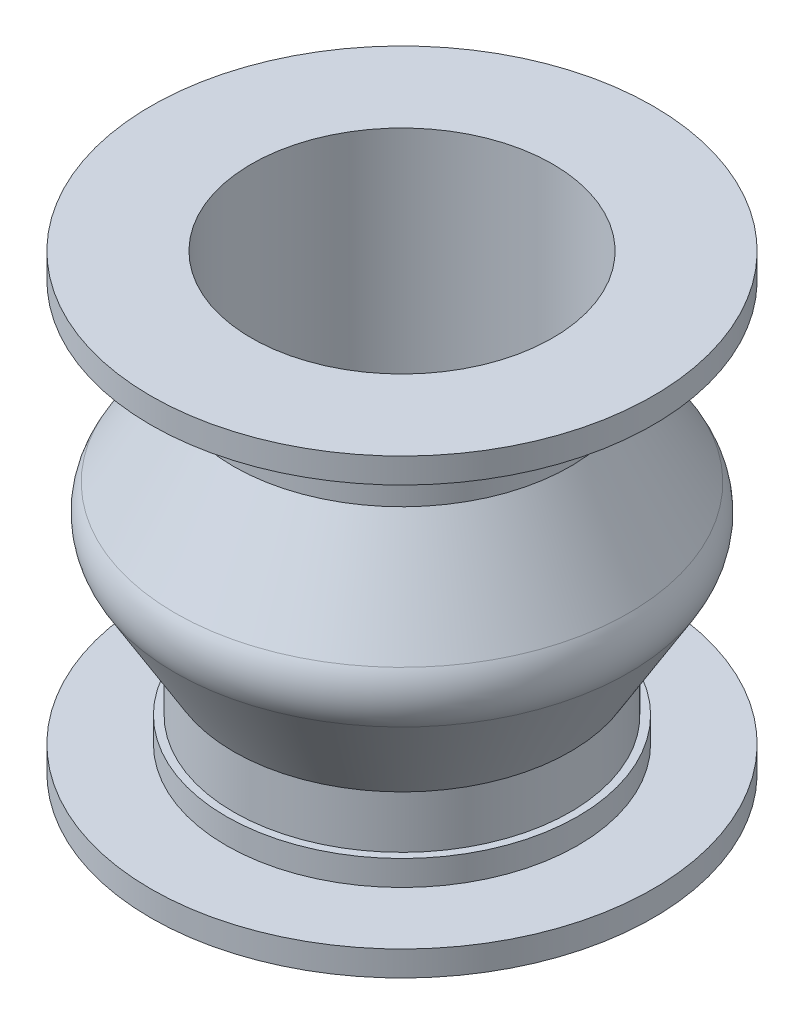
ISO-10303-21;
HEADER;
FILE_DESCRIPTION(('STEP AP214'),'2;1');
FILE_NAME('part.step','',(''),(''),'','','');
FILE_SCHEMA(('AUTOMOTIVE_DESIGN { 1 0 10303 214 1 1 1 1 }'));
ENDSEC;
DATA;
#1=APPLICATION_CONTEXT('core data for automotive mechanical design processes');
#2=APPLICATION_PROTOCOL_DEFINITION('international standard','automotive_design',2000,#1);
#3=PRODUCT_CONTEXT('',#1,'mechanical');
#4=PRODUCT('Part','Part','',(#3));
#5=PRODUCT_RELATED_PRODUCT_CATEGORY('part','',(#4));
#6=PRODUCT_DEFINITION_FORMATION('','',#4);
#7=PRODUCT_DEFINITION_CONTEXT('part definition',#1,'design');
#8=PRODUCT_DEFINITION('design','',#6,#7);
#9=PRODUCT_DEFINITION_SHAPE('','',#8);
#10=(LENGTH_UNIT() NAMED_UNIT(*) SI_UNIT(.MILLI.,.METRE.));
#11=(NAMED_UNIT(*) PLANE_ANGLE_UNIT() SI_UNIT($,.RADIAN.));
#12=(NAMED_UNIT(*) SI_UNIT($,.STERADIAN.) SOLID_ANGLE_UNIT());
#13=UNCERTAINTY_MEASURE_WITH_UNIT(LENGTH_MEASURE(1.E-05),#10,'distance_accuracy_value','');
#14=(GEOMETRIC_REPRESENTATION_CONTEXT(3) GLOBAL_UNCERTAINTY_ASSIGNED_CONTEXT((#13)) GLOBAL_UNIT_ASSIGNED_CONTEXT((#10,
#11,#12)) REPRESENTATION_CONTEXT('',''));
#15=CARTESIAN_POINT('',(0.,0.,0.));
#16=DIRECTION('',(0.,0.,1.));
#17=DIRECTION('',(1.,0.,0.));
#18=AXIS2_PLACEMENT_3D('',#15,#16,#17);
#19=CARTESIAN_POINT('',(0.,78.932584269663,0.));
#20=DIRECTION('',(0.,1.,0.));
#21=DIRECTION('',(0.,0.,1.));
#22=AXIS2_PLACEMENT_3D('',#19,#20,#21);
#23=CYLINDRICAL_SURFACE('',#22,35.);
#24=CARTESIAN_POINT('',(0.,40.,0.));
#25=DIRECTION('',(0.,1.,0.));
#26=DIRECTION('',(0.,0.,1.));
#27=AXIS2_PLACEMENT_3D('',#24,#25,#26);
#28=CIRCLE('',#27,35.);
#29=CARTESIAN_POINT('',(-5.,40.,-34.6410161513776));
#30=VERTEX_POINT('',#29);
#31=CARTESIAN_POINT('',(4.99999999999999,40.,-34.6410161513776));
#32=VERTEX_POINT('',#31);
#33=EDGE_CURVE('E133',#30,#32,#28,.T.);
#34=ORIENTED_EDGE('',*,*,#33,.F.);
#35=DIRECTION('',(0.,-1.,0.));
#36=VECTOR('',#35,1.);
#37=CARTESIAN_POINT('',(-5.,40.,-34.6410161513776));
#38=LINE('',#37,#36);
#39=CARTESIAN_POINT('',(-5.,35.,-34.6410161513776));
#40=VERTEX_POINT('',#39);
#41=EDGE_CURVE('E89',#30,#40,#38,.T.);
#42=ORIENTED_EDGE('',*,*,#41,.T.);
#43=CARTESIAN_POINT('',(0.,35.,0.));
#44=DIRECTION('',(0.,1.,0.));
#45=DIRECTION('',(0.,0.,1.));
#46=AXIS2_PLACEMENT_3D('',#43,#44,#45);
#47=CIRCLE('',#46,35.);
#48=CARTESIAN_POINT('',(4.99999999999999,35.,-34.6410161513776));
#49=VERTEX_POINT('',#48);
#50=EDGE_CURVE('E136',#40,#49,#47,.T.);
#51=ORIENTED_EDGE('',*,*,#50,.T.);
#52=DIRECTION('',(0.,-1.,0.));
#53=VECTOR('',#52,1.);
#54=CARTESIAN_POINT('',(4.99999999999999,40.,-34.6410161513776));
#55=LINE('',#54,#53);
#56=EDGE_CURVE('E121',#32,#49,#55,.T.);
#57=ORIENTED_EDGE('',*,*,#56,.F.);
#58=EDGE_LOOP('',(#34,#42,#51,#57));
#59=FACE_BOUND('',#58,.T.);
#60=ADVANCED_FACE('F38',(#59),#23,.T.);
#61=CARTESIAN_POINT('',(-50.,40.,0.));
#62=DIRECTION('',(0.,-1.,0.));
#63=DIRECTION('',(0.,0.,-1.));
#64=AXIS2_PLACEMENT_3D('',#61,#62,#63);
#65=PLANE('',#64);
#66=CARTESIAN_POINT('',(0.,40.,0.));
#67=DIRECTION('',(0.,1.,0.));
#68=DIRECTION('',(0.,0.,1.));
#69=AXIS2_PLACEMENT_3D('',#66,#67,#68);
#70=CIRCLE('',#69,50.);
#71=CARTESIAN_POINT('',(0.,40.,50.));
#72=VERTEX_POINT('',#71);
#73=EDGE_CURVE('E129',#72,#72,#70,.T.);
#74=ORIENTED_EDGE('',*,*,#73,.F.);
#75=EDGE_LOOP('',(#74));
#76=FACE_BOUND('',#75,.T.);
#77=CARTESIAN_POINT('',(0.,40.,0.));
#78=DIRECTION('',(0.,1.,0.));
#79=DIRECTION('',(0.,0.,1.));
#80=AXIS2_PLACEMENT_3D('',#77,#78,#79);
#81=CIRCLE('',#80,37.);
#82=CARTESIAN_POINT('',(5.,40.,-36.6606055596467));
#83=VERTEX_POINT('',#82);
#84=CARTESIAN_POINT('',(-5.,40.,-36.6606055596467));
#85=VERTEX_POINT('',#84);
#86=EDGE_CURVE('E54',#83,#85,#81,.T.);
#87=ORIENTED_EDGE('',*,*,#86,.T.);
#88=DIRECTION('',(0.,0.,1.));
#89=VECTOR('',#88,1.);
#90=CARTESIAN_POINT('',(-5.,40.,-36.6606055596467));
#91=LINE('',#90,#89);
#92=EDGE_CURVE('E84',#85,#30,#91,.T.);
#93=ORIENTED_EDGE('',*,*,#92,.T.);
#94=ORIENTED_EDGE('',*,*,#33,.T.);
#95=DIRECTION('',(0.,0.,-1.));
#96=VECTOR('',#95,1.);
#97=CARTESIAN_POINT('',(5.,40.,-36.6606055596467));
#98=LINE('',#97,#96);
#99=EDGE_CURVE('E62',#32,#83,#98,.T.);
#100=ORIENTED_EDGE('',*,*,#99,.T.);
#101=EDGE_LOOP('',(#87,#93,#94,#100));
#102=FACE_BOUND('',#101,.T.);
#103=ADVANCED_FACE('F101',(#76,#102),#65,.T.);
#104=CARTESIAN_POINT('',(0.,-45.,0.));
#105=DIRECTION('',(0.,-1.,0.));
#106=DIRECTION('',(0.,0.,-1.));
#107=AXIS2_PLACEMENT_3D('',#104,#105,#106);
#108=PLANE('',#107);
#109=CARTESIAN_POINT('',(0.,-45.,0.));
#110=DIRECTION('',(0.,-1.,0.));
#111=DIRECTION('',(0.,0.,-1.));
#112=AXIS2_PLACEMENT_3D('',#109,#110,#111);
#113=CIRCLE('',#112,30.);
#114=CARTESIAN_POINT('',(0.,-45.,-30.));
#115=VERTEX_POINT('',#114);
#116=EDGE_CURVE('E108',#115,#115,#113,.T.);
#117=ORIENTED_EDGE('',*,*,#116,.F.);
#118=EDGE_LOOP('',(#117));
#119=FACE_BOUND('',#118,.T.);
#120=CARTESIAN_POINT('',(0.,-45.,0.));
#121=DIRECTION('',(0.,1.,0.));
#122=DIRECTION('',(0.,0.,1.));
#123=AXIS2_PLACEMENT_3D('',#120,#121,#122);
#124=CIRCLE('',#123,50.);
#125=CARTESIAN_POINT('',(0.,-45.,50.));
#126=VERTEX_POINT('',#125);
#127=EDGE_CURVE('E11',#126,#126,#124,.T.);
#128=ORIENTED_EDGE('',*,*,#127,.F.);
#129=EDGE_LOOP('',(#128));
#130=FACE_BOUND('',#129,.T.);
#131=ADVANCED_FACE('F40',(#119,#130),#108,.T.);
#132=CARTESIAN_POINT('',(0.,78.932584269663,0.));
#133=DIRECTION('',(0.,1.,0.));
#134=DIRECTION('',(0.,0.,1.));
#135=AXIS2_PLACEMENT_3D('',#132,#133,#134);
#136=CYLINDRICAL_SURFACE('',#135,50.);
#137=ORIENTED_EDGE('',*,*,#127,.T.);
#138=EDGE_LOOP('',(#137));
#139=FACE_BOUND('',#138,.T.);
#140=CARTESIAN_POINT('',(0.,-40.,0.));
#141=DIRECTION('',(0.,1.,0.));
#142=DIRECTION('',(0.,0.,1.));
#143=AXIS2_PLACEMENT_3D('',#140,#141,#142);
#144=CIRCLE('',#143,50.);
#145=CARTESIAN_POINT('',(0.,-40.,50.));
#146=VERTEX_POINT('',#145);
#147=EDGE_CURVE('E47',#146,#146,#144,.T.);
#148=ORIENTED_EDGE('',*,*,#147,.F.);
#149=EDGE_LOOP('',(#148));
#150=FACE_BOUND('',#149,.T.);
#151=ADVANCED_FACE('F178',(#139,#150),#136,.T.);
#152=CARTESIAN_POINT('',(-50.,-40.,0.));
#153=DIRECTION('',(0.,1.,0.));
#154=DIRECTION('',(0.,0.,1.));
#155=AXIS2_PLACEMENT_3D('',#152,#153,#154);
#156=PLANE('',#155);
#157=ORIENTED_EDGE('',*,*,#147,.T.);
#158=EDGE_LOOP('',(#157));
#159=FACE_BOUND('',#158,.T.);
#160=CARTESIAN_POINT('',(0.,-40.,0.));
#161=DIRECTION('',(0.,1.,0.));
#162=DIRECTION('',(0.,0.,1.));
#163=AXIS2_PLACEMENT_3D('',#160,#161,#162);
#164=CIRCLE('',#163,35.);
#165=CARTESIAN_POINT('',(0.,-40.,35.));
#166=VERTEX_POINT('',#165);
#167=EDGE_CURVE('E168',#166,#166,#164,.T.);
#168=ORIENTED_EDGE('',*,*,#167,.F.);
#169=EDGE_LOOP('',(#168));
#170=FACE_BOUND('',#169,.T.);
#171=ADVANCED_FACE('F175',(#159,#170),#156,.T.);
#172=CARTESIAN_POINT('',(0.,78.932584269663,0.));
#173=DIRECTION('',(0.,1.,0.));
#174=DIRECTION('',(0.,0.,1.));
#175=AXIS2_PLACEMENT_3D('',#172,#173,#174);
#176=CYLINDRICAL_SURFACE('',#175,35.);
#177=ORIENTED_EDGE('',*,*,#167,.T.);
#178=EDGE_LOOP('',(#177));
#179=FACE_BOUND('',#178,.T.);
#180=CARTESIAN_POINT('',(0.,-35.,0.));
#181=DIRECTION('',(0.,1.,0.));
#182=DIRECTION('',(0.,0.,1.));
#183=AXIS2_PLACEMENT_3D('',#180,#181,#182);
#184=CIRCLE('',#183,35.);
#185=CARTESIAN_POINT('',(0.,-35.,35.));
#186=VERTEX_POINT('',#185);
#187=EDGE_CURVE('E164',#186,#186,#184,.T.);
#188=ORIENTED_EDGE('',*,*,#187,.F.);
#189=EDGE_LOOP('',(#188));
#190=FACE_BOUND('',#189,.T.);
#191=ADVANCED_FACE('F185',(#179,#190),#176,.T.);
#192=CARTESIAN_POINT('',(-35.,-35.,0.));
#193=DIRECTION('',(0.,1.,0.));
#194=DIRECTION('',(0.,0.,1.));
#195=AXIS2_PLACEMENT_3D('',#192,#193,#194);
#196=PLANE('',#195);
#197=ORIENTED_EDGE('',*,*,#187,.T.);
#198=EDGE_LOOP('',(#197));
#199=FACE_BOUND('',#198,.T.);
#200=CARTESIAN_POINT('',(0.,-35.,0.));
#201=DIRECTION('',(0.,1.,0.));
#202=DIRECTION('',(0.,0.,1.));
#203=AXIS2_PLACEMENT_3D('',#200,#201,#202);
#204=CIRCLE('',#203,33.5);
#205=CARTESIAN_POINT('',(0.,-35.,33.5));
#206=VERTEX_POINT('',#205);
#207=EDGE_CURVE('E160',#206,#206,#204,.T.);
#208=ORIENTED_EDGE('',*,*,#207,.F.);
#209=EDGE_LOOP('',(#208));
#210=FACE_BOUND('',#209,.T.);
#211=ADVANCED_FACE('F224',(#199,#210),#196,.T.);
#212=CARTESIAN_POINT('',(0.,78.932584269663,0.));
#213=DIRECTION('',(0.,1.,0.));
#214=DIRECTION('',(0.,0.,1.));
#215=AXIS2_PLACEMENT_3D('',#212,#213,#214);
#216=CYLINDRICAL_SURFACE('',#215,33.5);
#217=ORIENTED_EDGE('',*,*,#207,.T.);
#218=EDGE_LOOP('',(#217));
#219=FACE_BOUND('',#218,.T.);
#220=CARTESIAN_POINT('',(0.,-24.5845240525774,0.));
#221=DIRECTION('',(0.,1.,0.));
#222=DIRECTION('',(0.,0.,1.));
#223=AXIS2_PLACEMENT_3D('',#220,#221,#222);
#224=CIRCLE('',#223,33.5);
#225=CARTESIAN_POINT('',(0.,-24.5845240525774,33.5));
#226=VERTEX_POINT('',#225);
#227=EDGE_CURVE('E156',#226,#226,#224,.T.);
#228=ORIENTED_EDGE('',*,*,#227,.F.);
#229=EDGE_LOOP('',(#228));
#230=FACE_BOUND('',#229,.T.);
#231=ADVANCED_FACE('F220',(#219,#230),#216,.T.);
#232=CARTESIAN_POINT('',(0.,-5.14495755427531,0.));
#233=DIRECTION('',(0.,1.,0.));
#234=DIRECTION('',(0.,0.,1.));
#235=AXIS2_PLACEMENT_3D('',#232,#233,#234);
#236=CONICAL_SURFACE('',#235,45.1637398989812,0.540419500270584);
#237=ORIENTED_EDGE('',*,*,#227,.T.);
#238=EDGE_LOOP('',(#237));
#239=FACE_BOUND('',#238,.T.);
#240=CARTESIAN_POINT('',(0.,-5.14495755427531,0.));
#241=DIRECTION('',(0.,1.,0.));
#242=DIRECTION('',(0.,0.,1.));
#243=AXIS2_PLACEMENT_3D('',#240,#241,#242);
#244=CIRCLE('',#243,45.1637398989812);
#245=CARTESIAN_POINT('',(0.,-5.14495755427531,45.1637398989812));
#246=VERTEX_POINT('',#245);
#247=EDGE_CURVE('E152',#246,#246,#244,.T.);
#248=ORIENTED_EDGE('',*,*,#247,.F.);
#249=EDGE_LOOP('',(#248));
#250=FACE_BOUND('',#249,.T.);
#251=ADVANCED_FACE('F216',(#239,#250),#236,.T.);
#252=CARTESIAN_POINT('',(0.,0.,0.));
#253=DIRECTION('',(0.,1.,0.));
#254=DIRECTION('',(0.,0.,1.));
#255=AXIS2_PLACEMENT_3D('',#252,#253,#254);
#256=TOROIDAL_SURFACE('',#255,36.5888106418558,10.);
#257=ORIENTED_EDGE('',*,*,#247,.T.);
#258=EDGE_LOOP('',(#257));
#259=FACE_BOUND('',#258,.T.);
#260=CARTESIAN_POINT('',(0.,5.14495755427531,0.));
#261=DIRECTION('',(0.,1.,0.));
#262=DIRECTION('',(0.,0.,1.));
#263=AXIS2_PLACEMENT_3D('',#260,#261,#262);
#264=CIRCLE('',#263,45.1637398989812);
#265=CARTESIAN_POINT('',(0.,5.14495755427531,45.1637398989812));
#266=VERTEX_POINT('',#265);
#267=EDGE_CURVE('E148',#266,#266,#264,.T.);
#268=ORIENTED_EDGE('',*,*,#267,.F.);
#269=EDGE_LOOP('',(#268));
#270=FACE_BOUND('',#269,.T.);
#271=ADVANCED_FACE('F212',(#259,#270),#256,.T.);
#272=CARTESIAN_POINT('',(0.,24.5845240525773,0.));
#273=DIRECTION('',(0.,-1.,0.));
#274=DIRECTION('',(0.,0.,-1.));
#275=AXIS2_PLACEMENT_3D('',#272,#273,#274);
#276=CONICAL_SURFACE('',#275,33.5,0.540419500270584);
#277=ORIENTED_EDGE('',*,*,#267,.T.);
#278=EDGE_LOOP('',(#277));
#279=FACE_BOUND('',#278,.T.);
#280=CARTESIAN_POINT('',(0.,24.5845240525773,0.));
#281=DIRECTION('',(0.,1.,0.));
#282=DIRECTION('',(0.,0.,1.));
#283=AXIS2_PLACEMENT_3D('',#280,#281,#282);
#284=CIRCLE('',#283,33.5);
#285=CARTESIAN_POINT('',(0.,24.5845240525773,33.5));
#286=VERTEX_POINT('',#285);
#287=EDGE_CURVE('E144',#286,#286,#284,.T.);
#288=ORIENTED_EDGE('',*,*,#287,.F.);
#289=EDGE_LOOP('',(#288));
#290=FACE_BOUND('',#289,.T.);
#291=ADVANCED_FACE('F208',(#279,#290),#276,.T.);
#292=CARTESIAN_POINT('',(0.,78.932584269663,0.));
#293=DIRECTION('',(0.,1.,0.));
#294=DIRECTION('',(0.,0.,1.));
#295=AXIS2_PLACEMENT_3D('',#292,#293,#294);
#296=CYLINDRICAL_SURFACE('',#295,33.5);
#297=ORIENTED_EDGE('',*,*,#287,.T.);
#298=EDGE_LOOP('',(#297));
#299=FACE_BOUND('',#298,.T.);
#300=CARTESIAN_POINT('',(0.,35.,0.));
#301=DIRECTION('',(0.,1.,0.));
#302=DIRECTION('',(0.,0.,1.));
#303=AXIS2_PLACEMENT_3D('',#300,#301,#302);
#304=CIRCLE('',#303,33.5);
#305=CARTESIAN_POINT('',(0.,35.,33.5));
#306=VERTEX_POINT('',#305);
#307=EDGE_CURVE('E140',#306,#306,#304,.T.);
#308=ORIENTED_EDGE('',*,*,#307,.F.);
#309=EDGE_LOOP('',(#308));
#310=FACE_BOUND('',#309,.T.);
#311=ADVANCED_FACE('F204',(#299,#310),#296,.T.);
#312=CARTESIAN_POINT('',(-35.,35.,0.));
#313=DIRECTION('',(0.,-1.,0.));
#314=DIRECTION('',(0.,0.,-1.));
#315=AXIS2_PLACEMENT_3D('',#312,#313,#314);
#316=PLANE('',#315);
#317=ORIENTED_EDGE('',*,*,#307,.T.);
#318=EDGE_LOOP('',(#317));
#319=FACE_BOUND('',#318,.T.);
#320=ORIENTED_EDGE('',*,*,#50,.F.);
#321=DIRECTION('',(0.,0.,1.));
#322=VECTOR('',#321,1.);
#323=CARTESIAN_POINT('',(-5.,35.,-36.6606055596467));
#324=LINE('',#323,#322);
#325=CARTESIAN_POINT('',(-5.,35.,-36.6606055596467));
#326=VERTEX_POINT('',#325);
#327=EDGE_CURVE('E105',#326,#40,#324,.T.);
#328=ORIENTED_EDGE('',*,*,#327,.F.);
#329=CARTESIAN_POINT('',(0.,35.,0.));
#330=DIRECTION('',(0.,1.,0.));
#331=DIRECTION('',(0.,0.,1.));
#332=AXIS2_PLACEMENT_3D('',#329,#330,#331);
#333=CIRCLE('',#332,37.);
#334=CARTESIAN_POINT('',(5.,35.,-36.6606055596467));
#335=VERTEX_POINT('',#334);
#336=EDGE_CURVE('E97',#335,#326,#333,.T.);
#337=ORIENTED_EDGE('',*,*,#336,.F.);
#338=DIRECTION('',(0.,0.,-1.));
#339=VECTOR('',#338,1.);
#340=CARTESIAN_POINT('',(5.,35.,-36.6606055596467));
#341=LINE('',#340,#339);
#342=EDGE_CURVE('E79',#49,#335,#341,.T.);
#343=ORIENTED_EDGE('',*,*,#342,.F.);
#344=EDGE_LOOP('',(#320,#328,#337,#343));
#345=FACE_BOUND('',#344,.T.);
#346=ADVANCED_FACE('F200',(#319,#345),#316,.T.);
#347=CARTESIAN_POINT('',(0.,78.932584269663,0.));
#348=DIRECTION('',(0.,1.,0.));
#349=DIRECTION('',(0.,0.,1.));
#350=AXIS2_PLACEMENT_3D('',#347,#348,#349);
#351=CYLINDRICAL_SURFACE('',#350,50.);
#352=ORIENTED_EDGE('',*,*,#73,.T.);
#353=EDGE_LOOP('',(#352));
#354=FACE_BOUND('',#353,.T.);
#355=CARTESIAN_POINT('',(0.,45.,0.));
#356=DIRECTION('',(0.,1.,0.));
#357=DIRECTION('',(0.,0.,1.));
#358=AXIS2_PLACEMENT_3D('',#355,#356,#357);
#359=CIRCLE('',#358,50.);
#360=CARTESIAN_POINT('',(0.,45.,50.));
#361=VERTEX_POINT('',#360);
#362=EDGE_CURVE('E99',#361,#361,#359,.T.);
#363=ORIENTED_EDGE('',*,*,#362,.F.);
#364=EDGE_LOOP('',(#363));
#365=FACE_BOUND('',#364,.T.);
#366=ADVANCED_FACE('F203',(#354,#365),#351,.T.);
#367=CARTESIAN_POINT('',(0.,45.,0.));
#368=DIRECTION('',(0.,1.,0.));
#369=DIRECTION('',(0.,0.,1.));
#370=AXIS2_PLACEMENT_3D('',#367,#368,#369);
#371=PLANE('',#370);
#372=CARTESIAN_POINT('',(0.,45.,0.));
#373=DIRECTION('',(0.,-1.,0.));
#374=DIRECTION('',(0.,0.,-1.));
#375=AXIS2_PLACEMENT_3D('',#372,#373,#374);
#376=CIRCLE('',#375,30.);
#377=CARTESIAN_POINT('',(0.,45.,-30.));
#378=VERTEX_POINT('',#377);
#379=EDGE_CURVE('E116',#378,#378,#376,.T.);
#380=ORIENTED_EDGE('',*,*,#379,.T.);
#381=EDGE_LOOP('',(#380));
#382=FACE_BOUND('',#381,.T.);
#383=ORIENTED_EDGE('',*,*,#362,.T.);
#384=EDGE_LOOP('',(#383));
#385=FACE_BOUND('',#384,.T.);
#386=ADVANCED_FACE('F264',(#382,#385),#371,.T.);
#387=CARTESIAN_POINT('',(0.,40.,0.));
#388=DIRECTION('',(0.,-1.,0.));
#389=DIRECTION('',(0.,0.,-1.));
#390=AXIS2_PLACEMENT_3D('',#387,#388,#389);
#391=CYLINDRICAL_SURFACE('',#390,37.);
#392=ORIENTED_EDGE('',*,*,#336,.T.);
#393=DIRECTION('',(0.,-1.,0.));
#394=VECTOR('',#393,1.);
#395=CARTESIAN_POINT('',(-5.,40.,-36.6606055596467));
#396=LINE('',#395,#394);
#397=EDGE_CURVE('E86',#85,#326,#396,.T.);
#398=ORIENTED_EDGE('',*,*,#397,.F.);
#399=ORIENTED_EDGE('',*,*,#86,.F.);
#400=DIRECTION('',(0.,-1.,0.));
#401=VECTOR('',#400,1.);
#402=CARTESIAN_POINT('',(5.,40.,-36.6606055596467));
#403=LINE('',#402,#401);
#404=EDGE_CURVE('E113',#83,#335,#403,.T.);
#405=ORIENTED_EDGE('',*,*,#404,.T.);
#406=EDGE_LOOP('',(#392,#398,#399,#405));
#407=FACE_BOUND('',#406,.T.);
#408=ADVANCED_FACE('F95',(#407),#391,.T.);
#409=CARTESIAN_POINT('',(-5.,40.,-36.6606055596467));
#410=DIRECTION('',(1.,0.,0.));
#411=DIRECTION('',(0.,0.,-1.));
#412=AXIS2_PLACEMENT_3D('',#409,#410,#411);
#413=PLANE('',#412);
#414=ORIENTED_EDGE('',*,*,#327,.T.);
#415=ORIENTED_EDGE('',*,*,#41,.F.);
#416=ORIENTED_EDGE('',*,*,#92,.F.);
#417=ORIENTED_EDGE('',*,*,#397,.T.);
#418=EDGE_LOOP('',(#414,#415,#416,#417));
#419=FACE_BOUND('',#418,.T.);
#420=ADVANCED_FACE('F85',(#419),#413,.F.);
#421=CARTESIAN_POINT('',(5.,40.,-36.6606055596467));
#422=DIRECTION('',(-1.,0.,0.));
#423=DIRECTION('',(0.,0.,1.));
#424=AXIS2_PLACEMENT_3D('',#421,#422,#423);
#425=PLANE('',#424);
#426=ORIENTED_EDGE('',*,*,#342,.T.);
#427=ORIENTED_EDGE('',*,*,#404,.F.);
#428=ORIENTED_EDGE('',*,*,#99,.F.);
#429=ORIENTED_EDGE('',*,*,#56,.T.);
#430=EDGE_LOOP('',(#426,#427,#428,#429));
#431=FACE_BOUND('',#430,.T.);
#432=ADVANCED_FACE('F250',(#431),#425,.F.);
#433=CARTESIAN_POINT('',(0.,45.,0.));
#434=DIRECTION('',(0.,-1.,0.));
#435=DIRECTION('',(0.,0.,-1.));
#436=AXIS2_PLACEMENT_3D('',#433,#434,#435);
#437=CYLINDRICAL_SURFACE('',#436,30.);
#438=CARTESIAN_POINT('',(0.,45.,-30.));
#439=CARTESIAN_POINT('',(0.,44.0625,-30.));
#440=CARTESIAN_POINT('',(0.,43.125,-30.));
#441=CARTESIAN_POINT('',(0.,41.25,-30.));
#442=CARTESIAN_POINT('',(0.,40.3125,-30.));
#443=CARTESIAN_POINT('',(0.,38.4375,-30.));
#444=CARTESIAN_POINT('',(0.,37.5,-30.));
#445=CARTESIAN_POINT('',(0.,35.625,-30.));
#446=CARTESIAN_POINT('',(0.,34.6875,-30.));
#447=CARTESIAN_POINT('',(0.,32.8125,-30.));
#448=CARTESIAN_POINT('',(0.,31.875,-30.));
#449=CARTESIAN_POINT('',(0.,30.,-30.));
#450=CARTESIAN_POINT('',(0.,29.0625,-30.));
#451=CARTESIAN_POINT('',(0.,27.1875,-30.));
#452=CARTESIAN_POINT('',(0.,26.25,-30.));
#453=CARTESIAN_POINT('',(0.,24.375,-30.));
#454=CARTESIAN_POINT('',(0.,23.4375,-30.));
#455=CARTESIAN_POINT('',(0.,21.5625,-30.));
#456=CARTESIAN_POINT('',(0.,20.625,-30.));
#457=CARTESIAN_POINT('',(0.,18.75,-30.));
#458=CARTESIAN_POINT('',(0.,17.8125,-30.));
#459=CARTESIAN_POINT('',(0.,15.9375,-30.));
#460=CARTESIAN_POINT('',(0.,15.,-30.));
#461=CARTESIAN_POINT('',(0.,13.125,-30.));
#462=CARTESIAN_POINT('',(0.,12.1875,-30.));
#463=CARTESIAN_POINT('',(0.,10.3125,-30.));
#464=CARTESIAN_POINT('',(0.,9.37500000000001,-30.));
#465=CARTESIAN_POINT('',(0.,7.50000000000001,-30.));
#466=CARTESIAN_POINT('',(0.,6.56250000000001,-30.));
#467=CARTESIAN_POINT('',(0.,4.68750000000001,-30.));
#468=CARTESIAN_POINT('',(0.,3.75000000000001,-30.));
#469=CARTESIAN_POINT('',(0.,1.87500000000001,-30.));
#470=CARTESIAN_POINT('',(0.,0.937500000000012,-30.));
#471=CARTESIAN_POINT('',(0.,-0.937499999999985,-30.));
#472=CARTESIAN_POINT('',(0.,-1.87499999999998,-30.));
#473=CARTESIAN_POINT('',(0.,-3.74999999999998,-30.));
#474=CARTESIAN_POINT('',(0.,-4.68749999999998,-30.));
#475=CARTESIAN_POINT('',(0.,-6.56249999999998,-30.));
#476=CARTESIAN_POINT('',(0.,-7.49999999999999,-30.));
#477=CARTESIAN_POINT('',(0.,-9.37499999999999,-30.));
#478=CARTESIAN_POINT('',(0.,-10.3125,-30.));
#479=CARTESIAN_POINT('',(0.,-12.1875,-30.));
#480=CARTESIAN_POINT('',(0.,-13.125,-30.));
#481=CARTESIAN_POINT('',(0.,-15.,-30.));
#482=CARTESIAN_POINT('',(0.,-15.9375,-30.));
#483=CARTESIAN_POINT('',(0.,-17.8125,-30.));
#484=CARTESIAN_POINT('',(0.,-18.75,-30.));
#485=CARTESIAN_POINT('',(0.,-20.625,-30.));
#486=CARTESIAN_POINT('',(0.,-21.5625,-30.));
#487=CARTESIAN_POINT('',(0.,-23.4375,-30.));
#488=CARTESIAN_POINT('',(0.,-24.375,-30.));
#489=CARTESIAN_POINT('',(0.,-26.25,-30.));
#490=CARTESIAN_POINT('',(0.,-27.1875,-30.));
#491=CARTESIAN_POINT('',(0.,-29.0625,-30.));
#492=CARTESIAN_POINT('',(0.,-30.,-30.));
#493=CARTESIAN_POINT('',(0.,-31.875,-30.));
#494=CARTESIAN_POINT('',(0.,-32.8125,-30.));
#495=CARTESIAN_POINT('',(0.,-34.6875,-30.));
#496=CARTESIAN_POINT('',(0.,-35.625,-30.));
#497=CARTESIAN_POINT('',(0.,-37.5,-30.));
#498=CARTESIAN_POINT('',(0.,-38.4375,-30.));
#499=CARTESIAN_POINT('',(0.,-40.3125,-30.));
#500=CARTESIAN_POINT('',(0.,-41.25,-30.));
#501=CARTESIAN_POINT('',(0.,-43.125,-30.));
#502=CARTESIAN_POINT('',(0.,-44.0625,-30.));
#503=CARTESIAN_POINT('',(0.,-45.,-30.));
#504=B_SPLINE_CURVE_WITH_KNOTS('',3,(#438,#439,#440,#441,#442,#443,#444,#445,#446,#447,#448,
#449,#450,#451,#452,#453,#454,#455,#456,#457,#458,#459,#460,#461,#462,#463,#464,#465,#466,#467,
#468,#469,#470,#471,#472,#473,#474,#475,#476,#477,#478,#479,#480,#481,#482,#483,#484,#485,#486,
#487,#488,#489,#490,#491,#492,#493,#494,#495,#496,#497,#498,#499,#500,#501,#502,#503),
.UNSPECIFIED.,.F.,.F.,(4,2,2,2,2,2,2,2,2,2,2,2,2,2,2,2,2,2,2,2,2,2,2,2,2,2,2,2,2,2,2,2,4),(0.,
2.8125,5.625,8.4375,11.25,14.0625,16.875,19.6875,22.5,25.3125,28.125,30.9375,33.75,36.5625,
39.375,42.1875,45.,47.8125,50.625,53.4375,56.25,59.0625,61.875,64.6875,67.5,70.3125,73.125,
75.9375,78.75,81.5625,84.375,87.1875,90.),.UNSPECIFIED.);
#505=EDGE_CURVE('BSEAM252',#378,#115,#504,.T.);
#506=ORIENTED_EDGE('',*,*,#379,.F.);
#507=ORIENTED_EDGE('',*,*,#116,.T.);
#508=ORIENTED_EDGE('',*,*,#505,.T.);
#509=ORIENTED_EDGE('',*,*,#505,.F.);
#510=EDGE_LOOP('',(#506,#508,#507,#509));
#511=FACE_BOUND('',#510,.T.);
#512=ADVANCED_FACE('F252',(#511),#437,.F.);
#513=CLOSED_SHELL('',(#60,#103,#131,#151,#171,#191,#211,#231,#251,#271,#291,#311,#346,#366,#386,
#408,#420,#432,#512));
#514=MANIFOLD_SOLID_BREP('B2',#513);
#515=ADVANCED_BREP_SHAPE_REPRESENTATION('',(#18,#514),#14);
#516=SHAPE_DEFINITION_REPRESENTATION(#9,#515);
ENDSEC;
END-ISO-10303-21;
